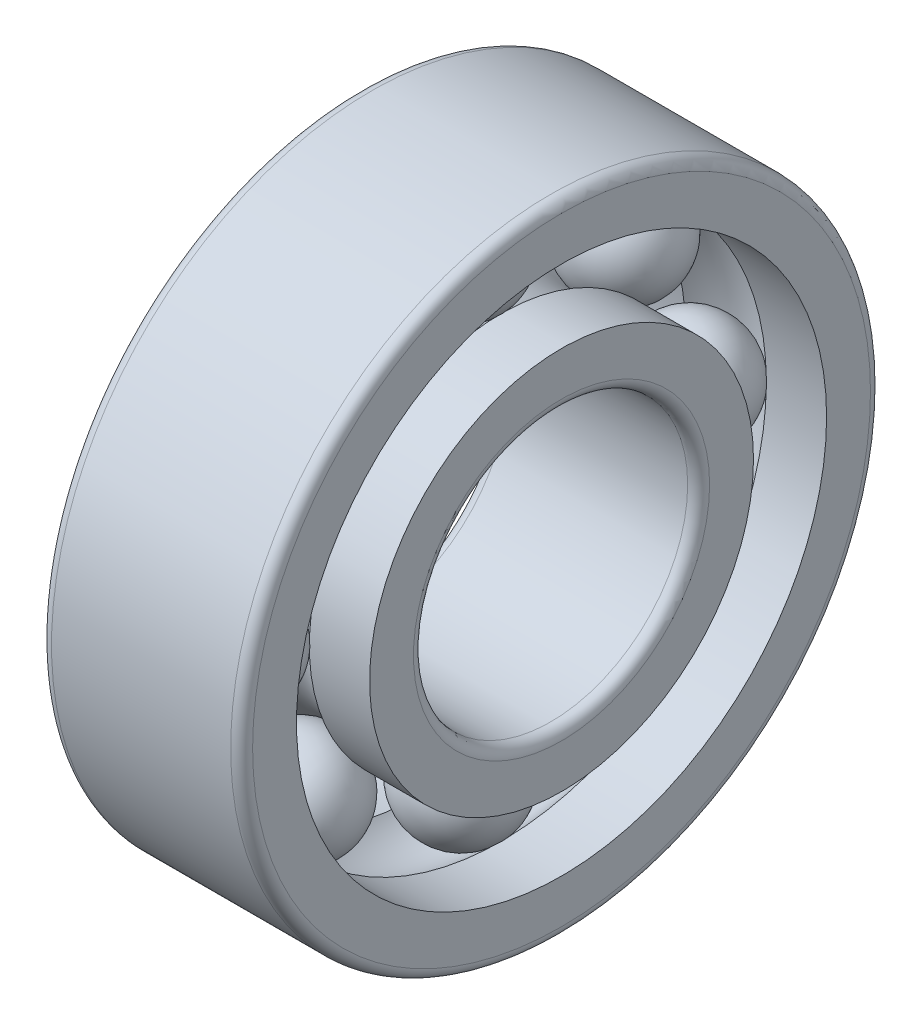
ISO-10303-21;
HEADER;
FILE_DESCRIPTION(('STEP AP214'),'2;1');
FILE_NAME('part.step','',(''),(''),'','','');
FILE_SCHEMA(('AUTOMOTIVE_DESIGN { 1 0 10303 214 1 1 1 1 }'));
ENDSEC;
DATA;
#1=APPLICATION_CONTEXT('core data for automotive mechanical design processes');
#2=APPLICATION_PROTOCOL_DEFINITION('international standard','automotive_design',2000,#1);
#3=PRODUCT_CONTEXT('',#1,'mechanical');
#4=PRODUCT('Part','Part','',(#3));
#5=PRODUCT_RELATED_PRODUCT_CATEGORY('part','',(#4));
#6=PRODUCT_DEFINITION_FORMATION('','',#4);
#7=PRODUCT_DEFINITION_CONTEXT('part definition',#1,'design');
#8=PRODUCT_DEFINITION('design','',#6,#7);
#9=PRODUCT_DEFINITION_SHAPE('','',#8);
#10=(LENGTH_UNIT() NAMED_UNIT(*) SI_UNIT(.MILLI.,.METRE.));
#11=(NAMED_UNIT(*) PLANE_ANGLE_UNIT() SI_UNIT($,.RADIAN.));
#12=(NAMED_UNIT(*) SI_UNIT($,.STERADIAN.) SOLID_ANGLE_UNIT());
#13=UNCERTAINTY_MEASURE_WITH_UNIT(LENGTH_MEASURE(1.E-05),#10,'distance_accuracy_value','');
#14=(GEOMETRIC_REPRESENTATION_CONTEXT(3) GLOBAL_UNCERTAINTY_ASSIGNED_CONTEXT((#13)) GLOBAL_UNIT_ASSIGNED_CONTEXT((#10,
#11,#12)) REPRESENTATION_CONTEXT('',''));
#15=CARTESIAN_POINT('',(0.,0.,0.));
#16=DIRECTION('',(0.,0.,1.));
#17=DIRECTION('',(1.,0.,0.));
#18=AXIS2_PLACEMENT_3D('',#15,#16,#17);
#19=CARTESIAN_POINT('',(0.,8.83883476483195,8.83883476483174));
#20=DIRECTION('',(1.,0.,0.));
#21=DIRECTION('',(0.,-0.707106781186556,-0.707106781186539));
#22=AXIS2_PLACEMENT_3D('',#19,#20,#21);
#23=SPHERICAL_SURFACE('',#22,3.);
#24=CARTESIAN_POINT('',(3.,8.83883476483195,8.83883476483174));
#25=VERTEX_POINT('',#24);
#26=VERTEX_LOOP('',#25);
#27=FACE_BOUND('',#26,.T.);
#28=ADVANCED_FACE('F37',(#27),#23,.T.);
#29=CLOSED_SHELL('',(#28));
#30=MANIFOLD_SOLID_BREP('B2',#29);
#31=CARTESIAN_POINT('',(0.,1.34441069388203E-13,12.5));
#32=DIRECTION('',(1.,0.,0.));
#33=DIRECTION('',(0.,0.,-1.));
#34=AXIS2_PLACEMENT_3D('',#31,#32,#33);
#35=SPHERICAL_SURFACE('',#34,3.);
#36=CARTESIAN_POINT('',(3.,1.34441069388203E-13,12.5));
#37=VERTEX_POINT('',#36);
#38=VERTEX_LOOP('',#37);
#39=FACE_BOUND('',#38,.T.);
#40=ADVANCED_FACE('F55',(#39),#35,.T.);
#41=CLOSED_SHELL('',(#40));
#42=MANIFOLD_SOLID_BREP('B6',#41);
#43=CARTESIAN_POINT('',(0.,-8.83883476483177,8.83883476483192));
#44=DIRECTION('',(1.,0.,0.));
#45=DIRECTION('',(0.,0.707106781186541,-0.707106781186554));
#46=AXIS2_PLACEMENT_3D('',#43,#44,#45);
#47=SPHERICAL_SURFACE('',#46,3.);
#48=CARTESIAN_POINT('',(3.,-8.83883476483177,8.83883476483192));
#49=VERTEX_POINT('',#48);
#50=VERTEX_LOOP('',#49);
#51=FACE_BOUND('',#50,.T.);
#52=ADVANCED_FACE('F73',(#51),#47,.T.);
#53=CLOSED_SHELL('',(#52));
#54=MANIFOLD_SOLID_BREP('B33',#53);
#55=CARTESIAN_POINT('',(0.,-12.5,0.));
#56=DIRECTION('',(1.,0.,0.));
#57=DIRECTION('',(0.,1.,0.));
#58=AXIS2_PLACEMENT_3D('',#55,#56,#57);
#59=SPHERICAL_SURFACE('',#58,3.);
#60=CARTESIAN_POINT('',(3.,-12.5,0.));
#61=VERTEX_POINT('',#60);
#62=VERTEX_LOOP('',#61);
#63=FACE_BOUND('',#62,.T.);
#64=ADVANCED_FACE('F91',(#63),#59,.T.);
#65=CLOSED_SHELL('',(#64));
#66=MANIFOLD_SOLID_BREP('B51',#65);
#67=CARTESIAN_POINT('',(0.,-8.83883476483189,-8.8388347648318));
#68=DIRECTION('',(1.,0.,0.));
#69=DIRECTION('',(0.,0.707106781186551,0.707106781186544));
#70=AXIS2_PLACEMENT_3D('',#67,#68,#69);
#71=SPHERICAL_SURFACE('',#70,3.);
#72=CARTESIAN_POINT('',(3.,-8.83883476483189,-8.8388347648318));
#73=VERTEX_POINT('',#72);
#74=VERTEX_LOOP('',#73);
#75=FACE_BOUND('',#74,.T.);
#76=ADVANCED_FACE('F109',(#75),#71,.T.);
#77=CLOSED_SHELL('',(#76));
#78=MANIFOLD_SOLID_BREP('B69',#77);
#79=CARTESIAN_POINT('',(0.,0.,-12.5));
#80=DIRECTION('',(1.,0.,0.));
#81=DIRECTION('',(0.,0.,1.));
#82=AXIS2_PLACEMENT_3D('',#79,#80,#81);
#83=SPHERICAL_SURFACE('',#82,3.);
#84=CARTESIAN_POINT('',(3.,0.,-12.5));
#85=VERTEX_POINT('',#84);
#86=VERTEX_LOOP('',#85);
#87=FACE_BOUND('',#86,.T.);
#88=ADVANCED_FACE('F127',(#87),#83,.T.);
#89=CLOSED_SHELL('',(#88));
#90=MANIFOLD_SOLID_BREP('B87',#89);
#91=CARTESIAN_POINT('',(0.,8.83883476483183,-8.83883476483186));
#92=DIRECTION('',(1.,0.,0.));
#93=DIRECTION('',(0.,-0.707106781186546,0.707106781186549));
#94=AXIS2_PLACEMENT_3D('',#91,#92,#93);
#95=SPHERICAL_SURFACE('',#94,3.);
#96=CARTESIAN_POINT('',(3.,8.83883476483183,-8.83883476483186));
#97=VERTEX_POINT('',#96);
#98=VERTEX_LOOP('',#97);
#99=FACE_BOUND('',#98,.T.);
#100=ADVANCED_FACE('F147',(#99),#95,.T.);
#101=CLOSED_SHELL('',(#100));
#102=MANIFOLD_SOLID_BREP('B105',#101);
#103=CARTESIAN_POINT('',(0.,0.,0.));
#104=DIRECTION('',(1.,0.,0.));
#105=DIRECTION('',(0.,0.,-1.));
#106=AXIS2_PLACEMENT_3D('',#103,#104,#105);
#107=TOROIDAL_SURFACE('',#106,12.5,2.975);
#108=CARTESIAN_POINT('',(2.2024134489237,0.,0.));
#109=DIRECTION('',(1.,0.,0.));
#110=DIRECTION('',(0.,0.,-1.));
#111=AXIS2_PLACEMENT_3D('',#108,#109,#110);
#112=CIRCLE('',#111,14.5);
#113=CARTESIAN_POINT('',(2.2024134489237,0.,-14.5));
#114=VERTEX_POINT('',#113);
#115=EDGE_CURVE('E146',#114,#114,#112,.T.);
#116=ORIENTED_EDGE('',*,*,#115,.T.);
#117=EDGE_LOOP('',(#116));
#118=FACE_BOUND('',#117,.T.);
#119=CARTESIAN_POINT('',(-2.2024134489237,0.,0.));
#120=DIRECTION('',(1.,0.,0.));
#121=DIRECTION('',(0.,0.,-1.));
#122=AXIS2_PLACEMENT_3D('',#119,#120,#121);
#123=CIRCLE('',#122,14.5);
#124=CARTESIAN_POINT('',(-2.2024134489237,0.,-14.5));
#125=VERTEX_POINT('',#124);
#126=EDGE_CURVE('E195',#125,#125,#123,.T.);
#127=ORIENTED_EDGE('',*,*,#126,.F.);
#128=EDGE_LOOP('',(#127));
#129=FACE_BOUND('',#128,.T.);
#130=ADVANCED_FACE('F167',(#118,#129),#107,.F.);
#131=CARTESIAN_POINT('',(-20.6375,0.,0.));
#132=DIRECTION('',(1.,0.,0.));
#133=DIRECTION('',(0.,0.,-1.));
#134=AXIS2_PLACEMENT_3D('',#131,#132,#133);
#135=CYLINDRICAL_SURFACE('',#134,14.5);
#136=CARTESIAN_POINT('',(5.5,0.,0.));
#137=DIRECTION('',(1.,0.,0.));
#138=DIRECTION('',(0.,0.,-1.));
#139=AXIS2_PLACEMENT_3D('',#136,#137,#138);
#140=CIRCLE('',#139,14.5);
#141=CARTESIAN_POINT('',(5.5,0.,-14.5));
#142=VERTEX_POINT('',#141);
#143=EDGE_CURVE('E173',#142,#142,#140,.T.);
#144=ORIENTED_EDGE('',*,*,#143,.T.);
#145=EDGE_LOOP('',(#144));
#146=FACE_BOUND('',#145,.T.);
#147=ORIENTED_EDGE('',*,*,#115,.F.);
#148=EDGE_LOOP('',(#147));
#149=FACE_BOUND('',#148,.T.);
#150=ADVANCED_FACE('F203',(#146,#149),#135,.F.);
#151=CARTESIAN_POINT('',(5.5,16.9,0.));
#152=DIRECTION('',(1.,0.,0.));
#153=DIRECTION('',(0.,0.,-1.));
#154=AXIS2_PLACEMENT_3D('',#151,#152,#153);
#155=PLANE('',#154);
#156=CARTESIAN_POINT('',(5.5,0.,0.));
#157=DIRECTION('',(1.,0.,0.));
#158=DIRECTION('',(0.,0.,-1.));
#159=AXIS2_PLACEMENT_3D('',#156,#157,#158);
#160=CIRCLE('',#159,16.9);
#161=CARTESIAN_POINT('',(5.5,0.,-16.9));
#162=VERTEX_POINT('',#161);
#163=EDGE_CURVE('E177',#162,#162,#160,.T.);
#164=ORIENTED_EDGE('',*,*,#163,.T.);
#165=EDGE_LOOP('',(#164));
#166=FACE_BOUND('',#165,.T.);
#167=ORIENTED_EDGE('',*,*,#143,.F.);
#168=EDGE_LOOP('',(#167));
#169=FACE_BOUND('',#168,.T.);
#170=ADVANCED_FACE('F207',(#166,#169),#155,.T.);
#171=CARTESIAN_POINT('',(4.9,0.,0.));
#172=DIRECTION('',(1.,0.,0.));
#173=DIRECTION('',(0.,0.,-1.));
#174=AXIS2_PLACEMENT_3D('',#171,#172,#173);
#175=TOROIDAL_SURFACE('',#174,16.9,0.6);
#176=CARTESIAN_POINT('',(4.9,0.,0.));
#177=DIRECTION('',(1.,0.,0.));
#178=DIRECTION('',(0.,0.,-1.));
#179=AXIS2_PLACEMENT_3D('',#176,#177,#178);
#180=CIRCLE('',#179,17.5);
#181=CARTESIAN_POINT('',(4.9,0.,-17.5));
#182=VERTEX_POINT('',#181);
#183=EDGE_CURVE('E181',#182,#182,#180,.T.);
#184=ORIENTED_EDGE('',*,*,#183,.T.);
#185=EDGE_LOOP('',(#184));
#186=FACE_BOUND('',#185,.T.);
#187=ORIENTED_EDGE('',*,*,#163,.F.);
#188=EDGE_LOOP('',(#187));
#189=FACE_BOUND('',#188,.T.);
#190=ADVANCED_FACE('F211',(#186,#189),#175,.T.);
#191=CARTESIAN_POINT('',(-20.6375,0.,0.));
#192=DIRECTION('',(1.,0.,0.));
#193=DIRECTION('',(0.,0.,-1.));
#194=AXIS2_PLACEMENT_3D('',#191,#192,#193);
#195=CYLINDRICAL_SURFACE('',#194,17.5);
#196=CARTESIAN_POINT('',(-4.9,0.,0.));
#197=DIRECTION('',(1.,0.,0.));
#198=DIRECTION('',(0.,0.,-1.));
#199=AXIS2_PLACEMENT_3D('',#196,#197,#198);
#200=CIRCLE('',#199,17.5);
#201=CARTESIAN_POINT('',(-4.9,0.,-17.5));
#202=VERTEX_POINT('',#201);
#203=EDGE_CURVE('E186',#202,#202,#200,.T.);
#204=ORIENTED_EDGE('',*,*,#203,.T.);
#205=EDGE_LOOP('',(#204));
#206=FACE_BOUND('',#205,.T.);
#207=ORIENTED_EDGE('',*,*,#183,.F.);
#208=EDGE_LOOP('',(#207));
#209=FACE_BOUND('',#208,.T.);
#210=ADVANCED_FACE('F218',(#206,#209),#195,.T.);
#211=CARTESIAN_POINT('',(-4.9,0.,0.));
#212=DIRECTION('',(1.,0.,0.));
#213=DIRECTION('',(0.,0.,-1.));
#214=AXIS2_PLACEMENT_3D('',#211,#212,#213);
#215=TOROIDAL_SURFACE('',#214,16.9,0.6);
#216=CARTESIAN_POINT('',(-5.5,0.,0.));
#217=DIRECTION('',(1.,0.,0.));
#218=DIRECTION('',(0.,0.,-1.));
#219=AXIS2_PLACEMENT_3D('',#216,#217,#218);
#220=CIRCLE('',#219,16.9);
#221=CARTESIAN_POINT('',(-5.5,0.,-16.9));
#222=VERTEX_POINT('',#221);
#223=EDGE_CURVE('E189',#222,#222,#220,.T.);
#224=ORIENTED_EDGE('',*,*,#223,.T.);
#225=EDGE_LOOP('',(#224));
#226=FACE_BOUND('',#225,.T.);
#227=ORIENTED_EDGE('',*,*,#203,.F.);
#228=EDGE_LOOP('',(#227));
#229=FACE_BOUND('',#228,.T.);
#230=ADVANCED_FACE('F222',(#226,#229),#215,.T.);
#231=CARTESIAN_POINT('',(-5.5,14.5,0.));
#232=DIRECTION('',(-1.,0.,0.));
#233=DIRECTION('',(0.,0.,1.));
#234=AXIS2_PLACEMENT_3D('',#231,#232,#233);
#235=PLANE('',#234);
#236=CARTESIAN_POINT('',(-5.5,0.,0.));
#237=DIRECTION('',(1.,0.,0.));
#238=DIRECTION('',(0.,0.,-1.));
#239=AXIS2_PLACEMENT_3D('',#236,#237,#238);
#240=CIRCLE('',#239,14.5);
#241=CARTESIAN_POINT('',(-5.5,0.,-14.5));
#242=VERTEX_POINT('',#241);
#243=EDGE_CURVE('E192',#242,#242,#240,.T.);
#244=ORIENTED_EDGE('',*,*,#243,.T.);
#245=EDGE_LOOP('',(#244));
#246=FACE_BOUND('',#245,.T.);
#247=ORIENTED_EDGE('',*,*,#223,.F.);
#248=EDGE_LOOP('',(#247));
#249=FACE_BOUND('',#248,.T.);
#250=ADVANCED_FACE('F226',(#246,#249),#235,.T.);
#251=CARTESIAN_POINT('',(-20.6375,0.,0.));
#252=DIRECTION('',(1.,0.,0.));
#253=DIRECTION('',(0.,0.,-1.));
#254=AXIS2_PLACEMENT_3D('',#251,#252,#253);
#255=CYLINDRICAL_SURFACE('',#254,14.5);
#256=ORIENTED_EDGE('',*,*,#126,.T.);
#257=EDGE_LOOP('',(#256));
#258=FACE_BOUND('',#257,.T.);
#259=ORIENTED_EDGE('',*,*,#243,.F.);
#260=EDGE_LOOP('',(#259));
#261=FACE_BOUND('',#260,.T.);
#262=ADVANCED_FACE('F199',(#258,#261),#255,.F.);
#263=CLOSED_SHELL('',(#130,#150,#170,#190,#210,#230,#250,#262));
#264=MANIFOLD_SOLID_BREP('B123',#263);
#265=CARTESIAN_POINT('',(0.,0.,0.));
#266=DIRECTION('',(1.,0.,0.));
#267=DIRECTION('',(0.,0.,-1.));
#268=AXIS2_PLACEMENT_3D('',#265,#266,#267);
#269=TOROIDAL_SURFACE('',#268,12.5,2.975);
#270=CARTESIAN_POINT('',(-2.2024134489237,0.,0.));
#271=DIRECTION('',(1.,0.,0.));
#272=DIRECTION('',(0.,0.,-1.));
#273=AXIS2_PLACEMENT_3D('',#270,#271,#272);
#274=CIRCLE('',#273,10.5);
#275=CARTESIAN_POINT('',(-2.2024134489237,0.,-10.5));
#276=VERTEX_POINT('',#275);
#277=EDGE_CURVE('E321',#276,#276,#274,.T.);
#278=ORIENTED_EDGE('',*,*,#277,.T.);
#279=EDGE_LOOP('',(#278));
#280=FACE_BOUND('',#279,.T.);
#281=CARTESIAN_POINT('',(2.2024134489237,0.,0.));
#282=DIRECTION('',(1.,0.,0.));
#283=DIRECTION('',(0.,0.,-1.));
#284=AXIS2_PLACEMENT_3D('',#281,#282,#283);
#285=CIRCLE('',#284,10.5);
#286=CARTESIAN_POINT('',(2.2024134489237,0.,-10.5));
#287=VERTEX_POINT('',#286);
#288=EDGE_CURVE('E166',#287,#287,#285,.T.);
#289=ORIENTED_EDGE('',*,*,#288,.F.);
#290=EDGE_LOOP('',(#289));
#291=FACE_BOUND('',#290,.T.);
#292=ADVANCED_FACE('F293',(#280,#291),#269,.F.);
#293=CARTESIAN_POINT('',(-20.6375,0.,0.));
#294=DIRECTION('',(1.,0.,0.));
#295=DIRECTION('',(0.,0.,-1.));
#296=AXIS2_PLACEMENT_3D('',#293,#294,#295);
#297=CYLINDRICAL_SURFACE('',#296,10.5);
#298=ORIENTED_EDGE('',*,*,#288,.T.);
#299=EDGE_LOOP('',(#298));
#300=FACE_BOUND('',#299,.T.);
#301=CARTESIAN_POINT('',(5.50000000000001,0.,0.));
#302=DIRECTION('',(1.,0.,0.));
#303=DIRECTION('',(0.,0.,-1.));
#304=AXIS2_PLACEMENT_3D('',#301,#302,#303);
#305=CIRCLE('',#304,10.5);
#306=CARTESIAN_POINT('',(5.50000000000001,0.,-10.5));
#307=VERTEX_POINT('',#306);
#308=EDGE_CURVE('E299',#307,#307,#305,.T.);
#309=ORIENTED_EDGE('',*,*,#308,.F.);
#310=EDGE_LOOP('',(#309));
#311=FACE_BOUND('',#310,.T.);
#312=ADVANCED_FACE('F339',(#300,#311),#297,.T.);
#313=CARTESIAN_POINT('',(5.5,8.1,0.));
#314=DIRECTION('',(1.,0.,0.));
#315=DIRECTION('',(0.,0.,-1.));
#316=AXIS2_PLACEMENT_3D('',#313,#314,#315);
#317=PLANE('',#316);
#318=ORIENTED_EDGE('',*,*,#308,.T.);
#319=EDGE_LOOP('',(#318));
#320=FACE_BOUND('',#319,.T.);
#321=CARTESIAN_POINT('',(5.50000000000001,0.,0.));
#322=DIRECTION('',(1.,0.,0.));
#323=DIRECTION('',(0.,0.,-1.));
#324=AXIS2_PLACEMENT_3D('',#321,#322,#323);
#325=CIRCLE('',#324,8.1);
#326=CARTESIAN_POINT('',(5.50000000000001,0.,-8.1));
#327=VERTEX_POINT('',#326);
#328=EDGE_CURVE('E303',#327,#327,#325,.T.);
#329=ORIENTED_EDGE('',*,*,#328,.F.);
#330=EDGE_LOOP('',(#329));
#331=FACE_BOUND('',#330,.T.);
#332=ADVANCED_FACE('F343',(#320,#331),#317,.T.);
#333=CARTESIAN_POINT('',(4.9,0.,0.));
#334=DIRECTION('',(1.,0.,0.));
#335=DIRECTION('',(0.,0.,-1.));
#336=AXIS2_PLACEMENT_3D('',#333,#334,#335);
#337=TOROIDAL_SURFACE('',#336,8.1,0.6);
#338=ORIENTED_EDGE('',*,*,#328,.T.);
#339=EDGE_LOOP('',(#338));
#340=FACE_BOUND('',#339,.T.);
#341=CARTESIAN_POINT('',(4.9,0.,0.));
#342=DIRECTION('',(1.,0.,0.));
#343=DIRECTION('',(0.,0.,-1.));
#344=AXIS2_PLACEMENT_3D('',#341,#342,#343);
#345=CIRCLE('',#344,7.5);
#346=CARTESIAN_POINT('',(4.9,0.,-7.5));
#347=VERTEX_POINT('',#346);
#348=EDGE_CURVE('E307',#347,#347,#345,.T.);
#349=ORIENTED_EDGE('',*,*,#348,.F.);
#350=EDGE_LOOP('',(#349));
#351=FACE_BOUND('',#350,.T.);
#352=ADVANCED_FACE('F347',(#340,#351),#337,.T.);
#353=CARTESIAN_POINT('',(-20.6375,0.,0.));
#354=DIRECTION('',(1.,0.,0.));
#355=DIRECTION('',(0.,0.,-1.));
#356=AXIS2_PLACEMENT_3D('',#353,#354,#355);
#357=CYLINDRICAL_SURFACE('',#356,7.5);
#358=ORIENTED_EDGE('',*,*,#348,.T.);
#359=EDGE_LOOP('',(#358));
#360=FACE_BOUND('',#359,.T.);
#361=CARTESIAN_POINT('',(-4.9,0.,0.));
#362=DIRECTION('',(1.,0.,0.));
#363=DIRECTION('',(0.,0.,-1.));
#364=AXIS2_PLACEMENT_3D('',#361,#362,#363);
#365=CIRCLE('',#364,7.5);
#366=CARTESIAN_POINT('',(-4.9,0.,-7.5));
#367=VERTEX_POINT('',#366);
#368=EDGE_CURVE('E312',#367,#367,#365,.T.);
#369=ORIENTED_EDGE('',*,*,#368,.F.);
#370=EDGE_LOOP('',(#369));
#371=FACE_BOUND('',#370,.T.);
#372=ADVANCED_FACE('F353',(#360,#371),#357,.F.);
#373=CARTESIAN_POINT('',(-4.9,0.,0.));
#374=DIRECTION('',(1.,0.,0.));
#375=DIRECTION('',(0.,0.,-1.));
#376=AXIS2_PLACEMENT_3D('',#373,#374,#375);
#377=TOROIDAL_SURFACE('',#376,8.1,0.6);
#378=ORIENTED_EDGE('',*,*,#368,.T.);
#379=EDGE_LOOP('',(#378));
#380=FACE_BOUND('',#379,.T.);
#381=CARTESIAN_POINT('',(-5.5,0.,0.));
#382=DIRECTION('',(1.,0.,0.));
#383=DIRECTION('',(0.,0.,-1.));
#384=AXIS2_PLACEMENT_3D('',#381,#382,#383);
#385=CIRCLE('',#384,8.1);
#386=CARTESIAN_POINT('',(-5.5,0.,-8.1));
#387=VERTEX_POINT('',#386);
#388=EDGE_CURVE('E315',#387,#387,#385,.T.);
#389=ORIENTED_EDGE('',*,*,#388,.F.);
#390=EDGE_LOOP('',(#389));
#391=FACE_BOUND('',#390,.T.);
#392=ADVANCED_FACE('F335',(#380,#391),#377,.T.);
#393=CARTESIAN_POINT('',(-5.5,10.5,0.));
#394=DIRECTION('',(-1.,0.,0.));
#395=DIRECTION('',(0.,0.,1.));
#396=AXIS2_PLACEMENT_3D('',#393,#394,#395);
#397=PLANE('',#396);
#398=ORIENTED_EDGE('',*,*,#388,.T.);
#399=EDGE_LOOP('',(#398));
#400=FACE_BOUND('',#399,.T.);
#401=CARTESIAN_POINT('',(-5.5,0.,0.));
#402=DIRECTION('',(1.,0.,0.));
#403=DIRECTION('',(0.,0.,-1.));
#404=AXIS2_PLACEMENT_3D('',#401,#402,#403);
#405=CIRCLE('',#404,10.5);
#406=CARTESIAN_POINT('',(-5.5,0.,-10.5));
#407=VERTEX_POINT('',#406);
#408=EDGE_CURVE('E318',#407,#407,#405,.T.);
#409=ORIENTED_EDGE('',*,*,#408,.F.);
#410=EDGE_LOOP('',(#409));
#411=FACE_BOUND('',#410,.T.);
#412=ADVANCED_FACE('F329',(#400,#411),#397,.T.);
#413=CARTESIAN_POINT('',(-20.6375,0.,0.));
#414=DIRECTION('',(1.,0.,0.));
#415=DIRECTION('',(0.,0.,-1.));
#416=AXIS2_PLACEMENT_3D('',#413,#414,#415);
#417=CYLINDRICAL_SURFACE('',#416,10.5);
#418=ORIENTED_EDGE('',*,*,#408,.T.);
#419=EDGE_LOOP('',(#418));
#420=FACE_BOUND('',#419,.T.);
#421=ORIENTED_EDGE('',*,*,#277,.F.);
#422=EDGE_LOOP('',(#421));
#423=FACE_BOUND('',#422,.T.);
#424=ADVANCED_FACE('F327',(#420,#423),#417,.T.);
#425=CLOSED_SHELL('',(#292,#312,#332,#352,#372,#392,#412,#424));
#426=MANIFOLD_SOLID_BREP('B141',#425);
#427=CARTESIAN_POINT('',(0.,12.5,0.));
#428=DIRECTION('',(1.,0.,0.));
#429=DIRECTION('',(0.,-1.,0.));
#430=AXIS2_PLACEMENT_3D('',#427,#428,#429);
#431=SPHERICAL_SURFACE('',#430,3.);
#432=CARTESIAN_POINT('',(3.,12.5,0.));
#433=VERTEX_POINT('',#432);
#434=VERTEX_LOOP('',#433);
#435=FACE_BOUND('',#434,.T.);
#436=ADVANCED_FACE('F414',(#435),#431,.T.);
#437=CLOSED_SHELL('',(#436));
#438=MANIFOLD_SOLID_BREP('B161',#437);
#439=ADVANCED_BREP_SHAPE_REPRESENTATION('',(#18,#30,#42,#54,#66,#78,#90,#102,#264,#426,#438),#14);
#440=SHAPE_DEFINITION_REPRESENTATION(#9,#439);
ENDSEC;
END-ISO-10303-21;
